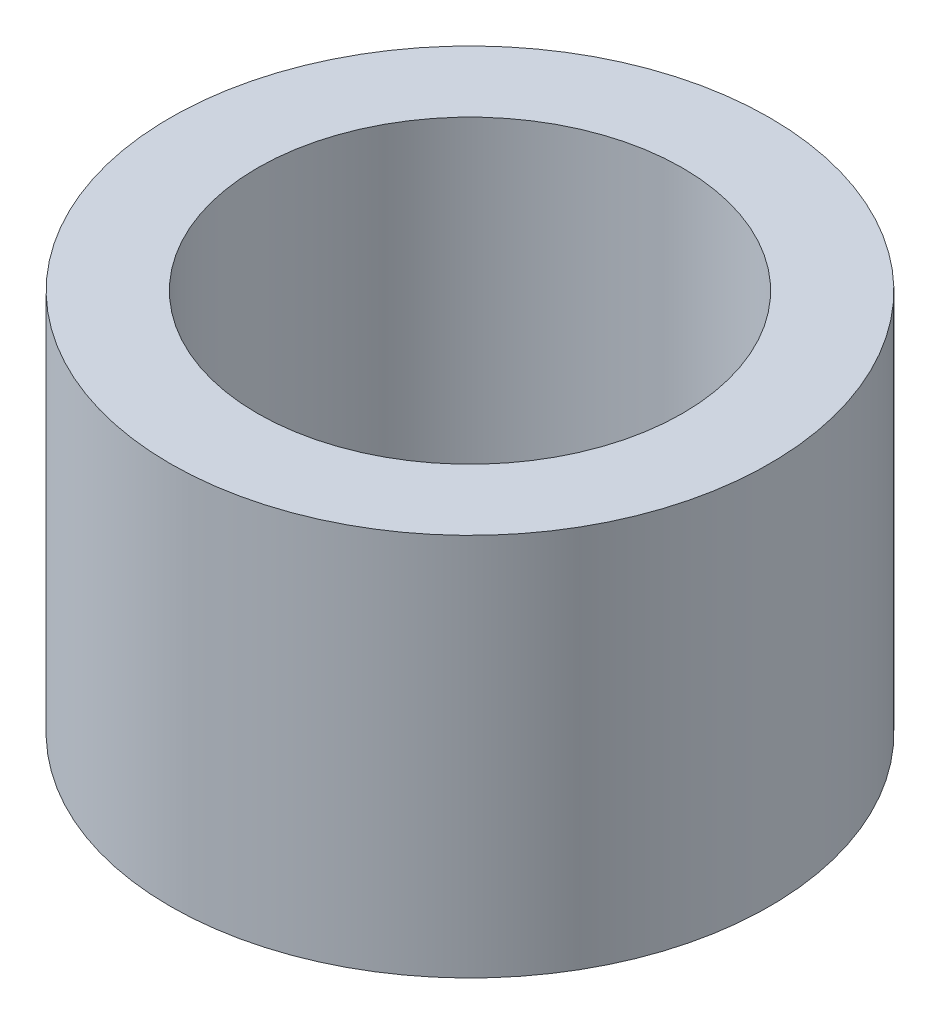
ISO-10303-21;
HEADER;
FILE_DESCRIPTION(('STEP AP214'),'2;1');
FILE_NAME('part.step','',(''),(''),'','','');
FILE_SCHEMA(('AUTOMOTIVE_DESIGN { 1 0 10303 214 1 1 1 1 }'));
ENDSEC;
DATA;
#1=APPLICATION_CONTEXT('core data for automotive mechanical design processes');
#2=APPLICATION_PROTOCOL_DEFINITION('international standard','automotive_design',2000,#1);
#3=PRODUCT_CONTEXT('',#1,'mechanical');
#4=PRODUCT('Part','Part','',(#3));
#5=PRODUCT_RELATED_PRODUCT_CATEGORY('part','',(#4));
#6=PRODUCT_DEFINITION_FORMATION('','',#4);
#7=PRODUCT_DEFINITION_CONTEXT('part definition',#1,'design');
#8=PRODUCT_DEFINITION('design','',#6,#7);
#9=PRODUCT_DEFINITION_SHAPE('','',#8);
#10=(LENGTH_UNIT() NAMED_UNIT(*) SI_UNIT(.MILLI.,.METRE.));
#11=(NAMED_UNIT(*) PLANE_ANGLE_UNIT() SI_UNIT($,.RADIAN.));
#12=(NAMED_UNIT(*) SI_UNIT($,.STERADIAN.) SOLID_ANGLE_UNIT());
#13=UNCERTAINTY_MEASURE_WITH_UNIT(LENGTH_MEASURE(1.E-05),#10,'distance_accuracy_value','');
#14=(GEOMETRIC_REPRESENTATION_CONTEXT(3) GLOBAL_UNCERTAINTY_ASSIGNED_CONTEXT((#13)) GLOBAL_UNIT_ASSIGNED_CONTEXT((#10,
#11,#12)) REPRESENTATION_CONTEXT('',''));
#15=CARTESIAN_POINT('',(0.,0.,0.));
#16=DIRECTION('',(0.,0.,1.));
#17=DIRECTION('',(1.,0.,0.));
#18=AXIS2_PLACEMENT_3D('',#15,#16,#17);
#19=CARTESIAN_POINT('',(0.,11.,0.));
#20=DIRECTION('',(0.,1.,0.));
#21=DIRECTION('',(0.,0.,1.));
#22=AXIS2_PLACEMENT_3D('',#19,#20,#21);
#23=PLANE('',#22);
#24=CARTESIAN_POINT('',(0.,11.,0.));
#25=DIRECTION('',(0.,1.,0.));
#26=DIRECTION('',(0.,0.,1.));
#27=AXIS2_PLACEMENT_3D('',#24,#25,#26);
#28=CIRCLE('',#27,8.6);
#29=CARTESIAN_POINT('',(0.,11.,8.6));
#30=VERTEX_POINT('',#29);
#31=EDGE_CURVE('E10',#30,#30,#28,.T.);
#32=ORIENTED_EDGE('',*,*,#31,.T.);
#33=EDGE_LOOP('',(#32));
#34=FACE_BOUND('',#33,.T.);
#35=CARTESIAN_POINT('',(0.,11.,0.));
#36=DIRECTION('',(0.,1.,0.));
#37=DIRECTION('',(0.,0.,1.));
#38=AXIS2_PLACEMENT_3D('',#35,#36,#37);
#39=CIRCLE('',#38,6.1);
#40=CARTESIAN_POINT('',(0.,11.,6.1));
#41=VERTEX_POINT('',#40);
#42=EDGE_CURVE('E48',#41,#41,#39,.T.);
#43=ORIENTED_EDGE('',*,*,#42,.F.);
#44=EDGE_LOOP('',(#43));
#45=FACE_BOUND('',#44,.T.);
#46=ADVANCED_FACE('F37',(#34,#45),#23,.T.);
#47=CARTESIAN_POINT('',(0.,0.,0.));
#48=DIRECTION('',(0.,1.,0.));
#49=DIRECTION('',(0.,0.,1.));
#50=AXIS2_PLACEMENT_3D('',#47,#48,#49);
#51=PLANE('',#50);
#52=CARTESIAN_POINT('',(0.,0.,0.));
#53=DIRECTION('',(0.,1.,0.));
#54=DIRECTION('',(0.,0.,1.));
#55=AXIS2_PLACEMENT_3D('',#52,#53,#54);
#56=CIRCLE('',#55,8.6);
#57=CARTESIAN_POINT('',(0.,0.,8.6));
#58=VERTEX_POINT('',#57);
#59=EDGE_CURVE('E41',#58,#58,#56,.T.);
#60=ORIENTED_EDGE('',*,*,#59,.F.);
#61=EDGE_LOOP('',(#60));
#62=FACE_BOUND('',#61,.T.);
#63=CARTESIAN_POINT('',(0.,0.,0.));
#64=DIRECTION('',(0.,1.,0.));
#65=DIRECTION('',(0.,0.,1.));
#66=AXIS2_PLACEMENT_3D('',#63,#64,#65);
#67=CIRCLE('',#66,6.1);
#68=CARTESIAN_POINT('',(0.,0.,6.1));
#69=VERTEX_POINT('',#68);
#70=EDGE_CURVE('E50',#69,#69,#67,.T.);
#71=ORIENTED_EDGE('',*,*,#70,.T.);
#72=EDGE_LOOP('',(#71));
#73=FACE_BOUND('',#72,.T.);
#74=ADVANCED_FACE('F60',(#62,#73),#51,.F.);
#75=CARTESIAN_POINT('',(0.,11.,0.));
#76=DIRECTION('',(0.,-1.,0.));
#77=DIRECTION('',(0.,0.,-1.));
#78=AXIS2_PLACEMENT_3D('',#75,#76,#77);
#79=CYLINDRICAL_SURFACE('',#78,8.6);
#80=ORIENTED_EDGE('',*,*,#31,.F.);
#81=EDGE_LOOP('',(#80));
#82=FACE_BOUND('',#81,.T.);
#83=ORIENTED_EDGE('',*,*,#59,.T.);
#84=EDGE_LOOP('',(#83));
#85=FACE_BOUND('',#84,.T.);
#86=ADVANCED_FACE('F39',(#82,#85),#79,.T.);
#87=CARTESIAN_POINT('',(0.,11.,0.));
#88=DIRECTION('',(0.,-1.,0.));
#89=DIRECTION('',(0.,0.,-1.));
#90=AXIS2_PLACEMENT_3D('',#87,#88,#89);
#91=CYLINDRICAL_SURFACE('',#90,6.1);
#92=ORIENTED_EDGE('',*,*,#42,.T.);
#93=EDGE_LOOP('',(#92));
#94=FACE_BOUND('',#93,.T.);
#95=ORIENTED_EDGE('',*,*,#70,.F.);
#96=EDGE_LOOP('',(#95));
#97=FACE_BOUND('',#96,.T.);
#98=ADVANCED_FACE('F56',(#94,#97),#91,.F.);
#99=CLOSED_SHELL('',(#46,#74,#86,#98));
#100=MANIFOLD_SOLID_BREP('B2',#99);
#101=ADVANCED_BREP_SHAPE_REPRESENTATION('',(#18,#100),#14);
#102=SHAPE_DEFINITION_REPRESENTATION(#9,#101);
ENDSEC;
END-ISO-10303-21;
